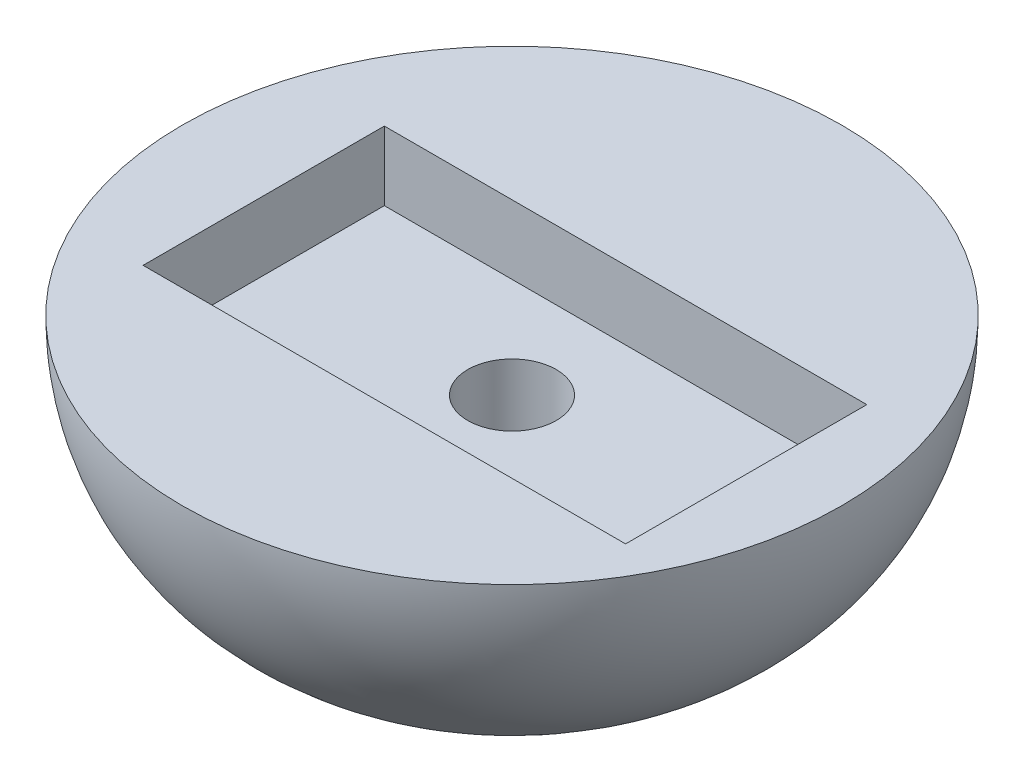
ISO-10303-21;
HEADER;
FILE_DESCRIPTION(('STEP AP214'),'2;1');
FILE_NAME('part.step','',(''),(''),'','','');
FILE_SCHEMA(('AUTOMOTIVE_DESIGN { 1 0 10303 214 1 1 1 1 }'));
ENDSEC;
DATA;
#1=APPLICATION_CONTEXT('core data for automotive mechanical design processes');
#2=APPLICATION_PROTOCOL_DEFINITION('international standard','automotive_design',2000,#1);
#3=PRODUCT_CONTEXT('',#1,'mechanical');
#4=PRODUCT('Part','Part','',(#3));
#5=PRODUCT_RELATED_PRODUCT_CATEGORY('part','',(#4));
#6=PRODUCT_DEFINITION_FORMATION('','',#4);
#7=PRODUCT_DEFINITION_CONTEXT('part definition',#1,'design');
#8=PRODUCT_DEFINITION('design','',#6,#7);
#9=PRODUCT_DEFINITION_SHAPE('','',#8);
#10=(LENGTH_UNIT() NAMED_UNIT(*) SI_UNIT(.MILLI.,.METRE.));
#11=(NAMED_UNIT(*) PLANE_ANGLE_UNIT() SI_UNIT($,.RADIAN.));
#12=(NAMED_UNIT(*) SI_UNIT($,.STERADIAN.) SOLID_ANGLE_UNIT());
#13=UNCERTAINTY_MEASURE_WITH_UNIT(LENGTH_MEASURE(1.E-05),#10,'distance_accuracy_value','');
#14=(GEOMETRIC_REPRESENTATION_CONTEXT(3) GLOBAL_UNCERTAINTY_ASSIGNED_CONTEXT((#13)) GLOBAL_UNIT_ASSIGNED_CONTEXT((#10,
#11,#12)) REPRESENTATION_CONTEXT('',''));
#15=CARTESIAN_POINT('',(0.,0.,0.));
#16=DIRECTION('',(0.,0.,1.));
#17=DIRECTION('',(1.,0.,0.));
#18=AXIS2_PLACEMENT_3D('',#15,#16,#17);
#19=CARTESIAN_POINT('',(10.16,0.,0.));
#20=DIRECTION('',(0.,0.,-1.));
#21=DIRECTION('',(1.,0.,0.));
#22=AXIS2_PLACEMENT_3D('',#19,#20,#21);
#23=ELLIPSE('',#22,41.91,40.64);
#24=TRIMMED_CURVE('',#23,(PARAMETER_VALUE(4.46752512617906)),(PARAMETER_VALUE(8.0988454881801)),
.T.,.PARAMETER.);
#25=CARTESIAN_POINT('',(0.,0.,0.));
#26=DIRECTION('',(0.,-1.,0.));
#27=AXIS1_PLACEMENT('',#25,#26);
#28=SURFACE_OF_REVOLUTION('',#24,#27);
#29=CARTESIAN_POINT('',(0.,0.,0.));
#30=DIRECTION('',(0.,-1.,0.));
#31=DIRECTION('',(1.,0.,0.));
#32=AXIS2_PLACEMENT_3D('',#29,#30,#31);
#33=CIRCLE('',#32,52.07);
#34=CARTESIAN_POINT('',(52.07,1.81801433313562E-13,0.));
#35=VERTEX_POINT('',#34);
#36=EDGE_CURVE('E137',#35,#35,#33,.T.);
#37=ORIENTED_EDGE('',*,*,#36,.T.);
#38=EDGE_LOOP('',(#37));
#39=FACE_BOUND('',#38,.T.);
#40=CARTESIAN_POINT('',(1.41893801610585E-13,-40.64,0.));
#41=DIRECTION('',(0.,-1.,0.));
#42=DIRECTION('',(1.,0.,0.));
#43=AXIS2_PLACEMENT_3D('',#40,#41,#42);
#44=CIRCLE('',#43,10.16);
#45=CARTESIAN_POINT('',(10.1600000000001,-40.6399999999999,0.));
#46=VERTEX_POINT('',#45);
#47=EDGE_CURVE('E43',#46,#46,#44,.T.);
#48=ORIENTED_EDGE('',*,*,#47,.F.);
#49=EDGE_LOOP('',(#48));
#50=FACE_BOUND('',#49,.T.);
#51=ADVANCED_FACE('F35',(#39,#50),#28,.T.);
#52=CARTESIAN_POINT('',(0.,-10.16,0.));
#53=DIRECTION('',(0.,1.,0.));
#54=DIRECTION('',(-1.,0.,0.));
#55=AXIS2_PLACEMENT_3D('',#52,#53,#54);
#56=CYLINDRICAL_SURFACE('',#55,6.985);
#57=CARTESIAN_POINT('',(0.,-10.889787861138,0.));
#58=DIRECTION('',(0.,-1.,0.));
#59=DIRECTION('',(0.,0.,-1.));
#60=AXIS2_PLACEMENT_3D('',#57,#58,#59);
#61=CIRCLE('',#60,6.985);
#62=CARTESIAN_POINT('',(0.,-10.889787861138,-6.985));
#63=VERTEX_POINT('',#62);
#64=EDGE_CURVE('E97',#63,#63,#61,.F.);
#65=ORIENTED_EDGE('',*,*,#64,.T.);
#66=EDGE_LOOP('',(#65));
#67=FACE_BOUND('',#66,.T.);
#68=CARTESIAN_POINT('',(1.41893801610585E-13,-40.64,0.));
#69=DIRECTION('',(0.,1.,0.));
#70=DIRECTION('',(-1.,0.,0.));
#71=AXIS2_PLACEMENT_3D('',#68,#69,#70);
#72=CIRCLE('',#71,6.985);
#73=CARTESIAN_POINT('',(-6.98499999999986,-40.64,0.));
#74=VERTEX_POINT('',#73);
#75=EDGE_CURVE('E98',#74,#74,#72,.T.);
#76=ORIENTED_EDGE('',*,*,#75,.F.);
#77=EDGE_LOOP('',(#76));
#78=FACE_BOUND('',#77,.T.);
#79=ADVANCED_FACE('F106',(#67,#78),#56,.F.);
#80=CARTESIAN_POINT('',(2.8378760322117E-13,-40.64,0.));
#81=DIRECTION('',(0.,1.,0.));
#82=DIRECTION('',(1.,0.,0.));
#83=AXIS2_PLACEMENT_3D('',#80,#81,#82);
#84=PLANE('',#83);
#85=ORIENTED_EDGE('',*,*,#75,.T.);
#86=EDGE_LOOP('',(#85));
#87=FACE_BOUND('',#86,.T.);
#88=ORIENTED_EDGE('',*,*,#47,.T.);
#89=EDGE_LOOP('',(#88));
#90=FACE_BOUND('',#89,.T.);
#91=ADVANCED_FACE('F112',(#87,#90),#84,.F.);
#92=CARTESIAN_POINT('',(-35.9789373088972,-10.889787861138,22.2828977134992));
#93=DIRECTION('',(0.,-1.,0.));
#94=DIRECTION('',(0.,0.,-1.));
#95=AXIS2_PLACEMENT_3D('',#92,#93,#94);
#96=PLANE('',#95);
#97=DIRECTION('',(0.,0.,1.));
#98=VECTOR('',#97,1.);
#99=CARTESIAN_POINT('',(-35.9789373088972,-10.889787861138,22.2828977134992));
#100=LINE('',#99,#98);
#101=CARTESIAN_POINT('',(-35.9789373088972,-10.889787861138,-15.8171022865008));
#102=VERTEX_POINT('',#101);
#103=CARTESIAN_POINT('',(-35.9789373088972,-10.889787861138,22.2828977134992));
#104=VERTEX_POINT('',#103);
#105=EDGE_CURVE('E140',#102,#104,#100,.T.);
#106=ORIENTED_EDGE('',*,*,#105,.T.);
#107=DIRECTION('',(1.,0.,0.));
#108=VECTOR('',#107,1.);
#109=CARTESIAN_POINT('',(-35.9789373088972,-10.889787861138,22.2828977134992));
#110=LINE('',#109,#108);
#111=CARTESIAN_POINT('',(40.2210626911028,-10.889787861138,22.2828977134992));
#112=VERTEX_POINT('',#111);
#113=EDGE_CURVE('E142',#104,#112,#110,.T.);
#114=ORIENTED_EDGE('',*,*,#113,.T.);
#115=DIRECTION('',(0.,0.,-1.));
#116=VECTOR('',#115,1.);
#117=CARTESIAN_POINT('',(40.2210626911028,-10.889787861138,22.2828977134992));
#118=LINE('',#117,#116);
#119=CARTESIAN_POINT('',(40.2210626911028,-10.889787861138,-15.8171022865008));
#120=VERTEX_POINT('',#119);
#121=EDGE_CURVE('E149',#112,#120,#118,.T.);
#122=ORIENTED_EDGE('',*,*,#121,.T.);
#123=DIRECTION('',(-1.,0.,0.));
#124=VECTOR('',#123,1.);
#125=CARTESIAN_POINT('',(-35.9789373088972,-10.889787861138,-15.8171022865008));
#126=LINE('',#125,#124);
#127=EDGE_CURVE('E89',#120,#102,#126,.T.);
#128=ORIENTED_EDGE('',*,*,#127,.T.);
#129=EDGE_LOOP('',(#106,#114,#122,#128));
#130=FACE_BOUND('',#129,.T.);
#131=ORIENTED_EDGE('',*,*,#64,.F.);
#132=EDGE_LOOP('',(#131));
#133=FACE_BOUND('',#132,.T.);
#134=ADVANCED_FACE('F109',(#130,#133),#96,.F.);
#135=CARTESIAN_POINT('',(-35.9789373088972,1.81021213886201,22.2828977134992));
#136=DIRECTION('',(1.,0.,0.));
#137=DIRECTION('',(0.,0.,-1.));
#138=AXIS2_PLACEMENT_3D('',#135,#136,#137);
#139=PLANE('',#138);
#140=DIRECTION('',(0.,0.,-1.));
#141=VECTOR('',#140,1.);
#142=CARTESIAN_POINT('',(-35.9789373088972,-1.26851654180804E-13,22.2828977134992));
#143=LINE('',#142,#141);
#144=CARTESIAN_POINT('',(-35.9789373088972,-1.26851654180804E-13,22.2828977134992));
#145=VERTEX_POINT('',#144);
#146=CARTESIAN_POINT('',(-35.9789373088972,0.,-15.8171022865008));
#147=VERTEX_POINT('',#146);
#148=EDGE_CURVE('E49',#145,#147,#143,.T.);
#149=ORIENTED_EDGE('',*,*,#148,.F.);
#150=DIRECTION('',(0.,-1.,0.));
#151=VECTOR('',#150,1.);
#152=CARTESIAN_POINT('',(-35.9789373088972,1.81021213886201,22.2828977134992));
#153=LINE('',#152,#151);
#154=EDGE_CURVE('E91',#145,#104,#153,.T.);
#155=ORIENTED_EDGE('',*,*,#154,.T.);
#156=ORIENTED_EDGE('',*,*,#105,.F.);
#157=DIRECTION('',(0.,-1.,0.));
#158=VECTOR('',#157,1.);
#159=CARTESIAN_POINT('',(-35.9789373088972,1.81021213886201,-15.8171022865008));
#160=LINE('',#159,#158);
#161=EDGE_CURVE('E56',#147,#102,#160,.T.);
#162=ORIENTED_EDGE('',*,*,#161,.F.);
#163=EDGE_LOOP('',(#149,#155,#156,#162));
#164=FACE_BOUND('',#163,.T.);
#165=ADVANCED_FACE('F111',(#164),#139,.T.);
#166=CARTESIAN_POINT('',(-35.9789373088972,1.81021213886201,22.2828977134992));
#167=DIRECTION('',(0.,0.,-1.));
#168=DIRECTION('',(-1.,0.,0.));
#169=AXIS2_PLACEMENT_3D('',#166,#167,#168);
#170=PLANE('',#169);
#171=DIRECTION('',(-1.,0.,0.));
#172=VECTOR('',#171,1.);
#173=CARTESIAN_POINT('',(-35.9789373088972,-1.26851654180804E-13,22.2828977134992));
#174=LINE('',#173,#172);
#175=CARTESIAN_POINT('',(40.2210626911028,1.39211558947139E-13,22.2828977134992));
#176=VERTEX_POINT('',#175);
#177=EDGE_CURVE('E86',#176,#145,#174,.T.);
#178=ORIENTED_EDGE('',*,*,#177,.F.);
#179=DIRECTION('',(0.,-1.,0.));
#180=VECTOR('',#179,1.);
#181=CARTESIAN_POINT('',(40.2210626911028,1.81021213886201,22.2828977134992));
#182=LINE('',#181,#180);
#183=EDGE_CURVE('E85',#176,#112,#182,.T.);
#184=ORIENTED_EDGE('',*,*,#183,.T.);
#185=ORIENTED_EDGE('',*,*,#113,.F.);
#186=ORIENTED_EDGE('',*,*,#154,.F.);
#187=EDGE_LOOP('',(#178,#184,#185,#186));
#188=FACE_BOUND('',#187,.T.);
#189=ADVANCED_FACE('F120',(#188),#170,.T.);
#190=CARTESIAN_POINT('',(40.2210626911028,1.81021213886201,22.2828977134992));
#191=DIRECTION('',(-1.,0.,0.));
#192=DIRECTION('',(0.,0.,1.));
#193=AXIS2_PLACEMENT_3D('',#190,#191,#192);
#194=PLANE('',#193);
#195=DIRECTION('',(0.,0.,1.));
#196=VECTOR('',#195,1.);
#197=CARTESIAN_POINT('',(40.2210626911028,1.39211558947139E-13,22.2828977134992));
#198=LINE('',#197,#196);
#199=CARTESIAN_POINT('',(40.2210626911028,1.41367628184014E-13,-15.8171022865008));
#200=VERTEX_POINT('',#199);
#201=EDGE_CURVE('E76',#200,#176,#198,.T.);
#202=ORIENTED_EDGE('',*,*,#201,.F.);
#203=DIRECTION('',(0.,-1.,0.));
#204=VECTOR('',#203,1.);
#205=CARTESIAN_POINT('',(40.2210626911028,1.81021213886201,-15.8171022865008));
#206=LINE('',#205,#204);
#207=EDGE_CURVE('E83',#200,#120,#206,.T.);
#208=ORIENTED_EDGE('',*,*,#207,.T.);
#209=ORIENTED_EDGE('',*,*,#121,.F.);
#210=ORIENTED_EDGE('',*,*,#183,.F.);
#211=EDGE_LOOP('',(#202,#208,#209,#210));
#212=FACE_BOUND('',#211,.T.);
#213=ADVANCED_FACE('F81',(#212),#194,.T.);
#214=CARTESIAN_POINT('',(-35.9789373088972,1.81021213886201,-15.8171022865008));
#215=DIRECTION('',(0.,0.,1.));
#216=DIRECTION('',(1.,0.,0.));
#217=AXIS2_PLACEMENT_3D('',#214,#215,#216);
#218=PLANE('',#217);
#219=DIRECTION('',(1.,0.,0.));
#220=VECTOR('',#219,1.);
#221=CARTESIAN_POINT('',(-35.9789373088972,-1.24683249835833E-13,-15.8171022865008));
#222=LINE('',#221,#220);
#223=EDGE_CURVE('E11',#147,#200,#222,.T.);
#224=ORIENTED_EDGE('',*,*,#223,.F.);
#225=ORIENTED_EDGE('',*,*,#161,.T.);
#226=ORIENTED_EDGE('',*,*,#127,.F.);
#227=ORIENTED_EDGE('',*,*,#207,.F.);
#228=EDGE_LOOP('',(#224,#225,#226,#227));
#229=FACE_BOUND('',#228,.T.);
#230=ADVANCED_FACE('F88',(#229),#218,.T.);
#231=CARTESIAN_POINT('',(0.,0.,0.));
#232=DIRECTION('',(0.,-1.,0.));
#233=DIRECTION('',(1.,0.,0.));
#234=AXIS2_PLACEMENT_3D('',#231,#232,#233);
#235=PLANE('',#234);
#236=ORIENTED_EDGE('',*,*,#148,.T.);
#237=ORIENTED_EDGE('',*,*,#223,.T.);
#238=ORIENTED_EDGE('',*,*,#201,.T.);
#239=ORIENTED_EDGE('',*,*,#177,.T.);
#240=EDGE_LOOP('',(#236,#237,#238,#239));
#241=FACE_BOUND('',#240,.T.);
#242=ORIENTED_EDGE('',*,*,#36,.F.);
#243=EDGE_LOOP('',(#242));
#244=FACE_BOUND('',#243,.T.);
#245=ADVANCED_FACE('F74',(#241,#244),#235,.F.);
#246=CLOSED_SHELL('',(#51,#79,#91,#134,#165,#189,#213,#230,#245));
#247=MANIFOLD_SOLID_BREP('B2',#246);
#248=ADVANCED_BREP_SHAPE_REPRESENTATION('',(#18,#247),#14);
#249=SHAPE_DEFINITION_REPRESENTATION(#9,#248);
ENDSEC;
END-ISO-10303-21;
